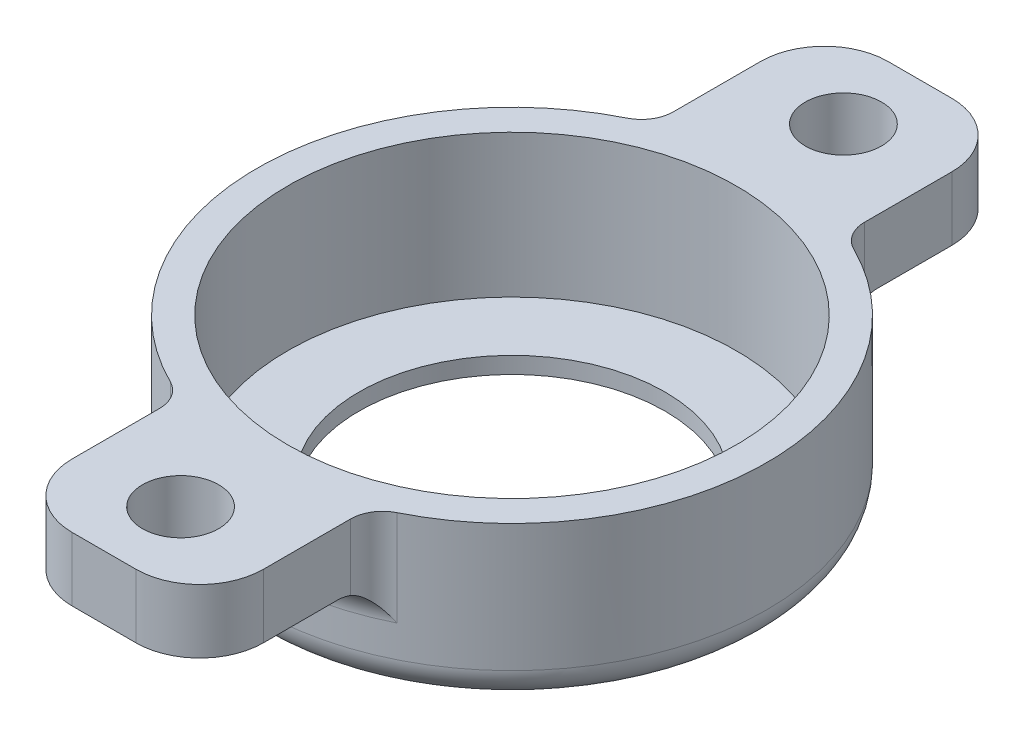
ISO-10303-21;
HEADER;
FILE_DESCRIPTION(('STEP AP214'),'2;1');
FILE_NAME('part.step','',(''),(''),'','','');
FILE_SCHEMA(('AUTOMOTIVE_DESIGN { 1 0 10303 214 1 1 1 1 }'));
ENDSEC;
DATA;
#1=APPLICATION_CONTEXT('core data for automotive mechanical design processes');
#2=APPLICATION_PROTOCOL_DEFINITION('international standard','automotive_design',2000,#1);
#3=PRODUCT_CONTEXT('',#1,'mechanical');
#4=PRODUCT('Part','Part','',(#3));
#5=PRODUCT_RELATED_PRODUCT_CATEGORY('part','',(#4));
#6=PRODUCT_DEFINITION_FORMATION('','',#4);
#7=PRODUCT_DEFINITION_CONTEXT('part definition',#1,'design');
#8=PRODUCT_DEFINITION('design','',#6,#7);
#9=PRODUCT_DEFINITION_SHAPE('','',#8);
#10=(LENGTH_UNIT() NAMED_UNIT(*) SI_UNIT(.MILLI.,.METRE.));
#11=(NAMED_UNIT(*) PLANE_ANGLE_UNIT() SI_UNIT($,.RADIAN.));
#12=(NAMED_UNIT(*) SI_UNIT($,.STERADIAN.) SOLID_ANGLE_UNIT());
#13=UNCERTAINTY_MEASURE_WITH_UNIT(LENGTH_MEASURE(1.E-05),#10,'distance_accuracy_value','');
#14=(GEOMETRIC_REPRESENTATION_CONTEXT(3) GLOBAL_UNCERTAINTY_ASSIGNED_CONTEXT((#13)) GLOBAL_UNIT_ASSIGNED_CONTEXT((#10,
#11,#12)) REPRESENTATION_CONTEXT('',''));
#15=CARTESIAN_POINT('',(0.,0.,0.));
#16=DIRECTION('',(0.,0.,1.));
#17=DIRECTION('',(1.,0.,0.));
#18=AXIS2_PLACEMENT_3D('',#15,#16,#17);
#19=CARTESIAN_POINT('',(0.,0.,0.));
#20=DIRECTION('',(0.,1.,0.));
#21=DIRECTION('',(0.,0.,1.));
#22=AXIS2_PLACEMENT_3D('',#19,#20,#21);
#23=CYLINDRICAL_SURFACE('',#22,7.62);
#24=CARTESIAN_POINT('',(0.,0.,0.));
#25=DIRECTION('',(0.,1.,0.));
#26=DIRECTION('',(0.,0.,1.));
#27=AXIS2_PLACEMENT_3D('',#24,#25,#26);
#28=CIRCLE('',#27,7.62);
#29=CARTESIAN_POINT('',(0.,0.,7.62));
#30=VERTEX_POINT('',#29);
#31=EDGE_CURVE('E395',#30,#30,#28,.T.);
#32=ORIENTED_EDGE('',*,*,#31,.F.);
#33=EDGE_LOOP('',(#32));
#34=FACE_BOUND('',#33,.T.);
#35=CARTESIAN_POINT('',(0.,0.8255,0.));
#36=DIRECTION('',(0.,1.,0.));
#37=DIRECTION('',(0.,0.,1.));
#38=AXIS2_PLACEMENT_3D('',#35,#36,#37);
#39=CIRCLE('',#38,7.62);
#40=CARTESIAN_POINT('',(0.,0.8255,7.62));
#41=VERTEX_POINT('',#40);
#42=EDGE_CURVE('E390',#41,#41,#39,.F.);
#43=ORIENTED_EDGE('',*,*,#42,.F.);
#44=EDGE_LOOP('',(#43));
#45=FACE_BOUND('',#44,.T.);
#46=ADVANCED_FACE('F36',(#34,#45),#23,.F.);
#47=CARTESIAN_POINT('',(0.,7.9375,0.));
#48=DIRECTION('',(0.,-1.,0.));
#49=DIRECTION('',(0.,0.,-1.));
#50=AXIS2_PLACEMENT_3D('',#47,#48,#49);
#51=CYLINDRICAL_SURFACE('',#50,12.7);
#52=CARTESIAN_POINT('',(0.,1.5875,0.));
#53=DIRECTION('',(0.,1.,0.));
#54=DIRECTION('',(0.,0.,1.));
#55=AXIS2_PLACEMENT_3D('',#52,#53,#54);
#56=CIRCLE('',#55,12.7);
#57=CARTESIAN_POINT('',(0.,1.5875,12.7));
#58=VERTEX_POINT('',#57);
#59=EDGE_CURVE('E237',#58,#58,#56,.T.);
#60=ORIENTED_EDGE('',*,*,#59,.T.);
#61=EDGE_LOOP('',(#60));
#62=FACE_BOUND('',#61,.T.);
#63=CARTESIAN_POINT('',(0.,3.175,0.));
#64=DIRECTION('',(0.,1.,0.));
#65=DIRECTION('',(0.,0.,1.));
#66=AXIS2_PLACEMENT_3D('',#63,#64,#65);
#67=CIRCLE('',#66,12.7);
#68=CARTESIAN_POINT('',(5.64444444444444,3.175,11.3767414892657));
#69=VERTEX_POINT('',#68);
#70=CARTESIAN_POINT('',(-5.64444444444444,3.175,11.3767414892657));
#71=VERTEX_POINT('',#70);
#72=EDGE_CURVE('E247',#69,#71,#67,.F.);
#73=ORIENTED_EDGE('',*,*,#72,.T.);
#74=DIRECTION('',(0.,-1.,0.));
#75=VECTOR('',#74,1.);
#76=CARTESIAN_POINT('',(-5.64444444444444,7.9375,11.3767414892657));
#77=LINE('',#76,#75);
#78=CARTESIAN_POINT('',(-5.64444444444444,7.9375,11.3767414892657));
#79=VERTEX_POINT('',#78);
#80=EDGE_CURVE('E251',#71,#79,#77,.F.);
#81=ORIENTED_EDGE('',*,*,#80,.T.);
#82=CARTESIAN_POINT('',(0.,7.9375,0.));
#83=DIRECTION('',(0.,1.,0.));
#84=DIRECTION('',(0.,0.,1.));
#85=AXIS2_PLACEMENT_3D('',#82,#83,#84);
#86=CIRCLE('',#85,12.7);
#87=CARTESIAN_POINT('',(-5.64444444444444,7.9375,-11.3767414892657));
#88=VERTEX_POINT('',#87);
#89=EDGE_CURVE('E195',#88,#79,#86,.T.);
#90=ORIENTED_EDGE('',*,*,#89,.F.);
#91=DIRECTION('',(0.,-1.,0.));
#92=VECTOR('',#91,1.);
#93=CARTESIAN_POINT('',(-5.64444444444445,7.9375,-11.3767414892657));
#94=LINE('',#93,#92);
#95=CARTESIAN_POINT('',(-5.64444444444444,3.175,-11.3767414892657));
#96=VERTEX_POINT('',#95);
#97=EDGE_CURVE('E242',#88,#96,#94,.T.);
#98=ORIENTED_EDGE('',*,*,#97,.T.);
#99=CARTESIAN_POINT('',(0.,3.175,0.));
#100=DIRECTION('',(0.,1.,0.));
#101=DIRECTION('',(0.,0.,1.));
#102=AXIS2_PLACEMENT_3D('',#99,#100,#101);
#103=CIRCLE('',#102,12.7);
#104=CARTESIAN_POINT('',(5.64444444444444,3.175,-11.3767414892657));
#105=VERTEX_POINT('',#104);
#106=EDGE_CURVE('E240',#96,#105,#103,.F.);
#107=ORIENTED_EDGE('',*,*,#106,.T.);
#108=DIRECTION('',(0.,-1.,0.));
#109=VECTOR('',#108,1.);
#110=CARTESIAN_POINT('',(5.64444444444444,7.9375,-11.3767414892657));
#111=LINE('',#110,#109);
#112=CARTESIAN_POINT('',(5.64444444444444,7.9375,-11.3767414892657));
#113=VERTEX_POINT('',#112);
#114=EDGE_CURVE('E244',#105,#113,#111,.F.);
#115=ORIENTED_EDGE('',*,*,#114,.T.);
#116=CARTESIAN_POINT('',(5.64444444444444,7.9375,11.3767414892657));
#117=VERTEX_POINT('',#116);
#118=EDGE_CURVE('E199',#117,#113,#86,.T.);
#119=ORIENTED_EDGE('',*,*,#118,.F.);
#120=DIRECTION('',(0.,-1.,0.));
#121=VECTOR('',#120,1.);
#122=CARTESIAN_POINT('',(5.64444444444445,7.9375,11.3767414892657));
#123=LINE('',#122,#121);
#124=EDGE_CURVE('E249',#117,#69,#123,.T.);
#125=ORIENTED_EDGE('',*,*,#124,.T.);
#126=EDGE_LOOP('',(#73,#81,#90,#98,#107,#115,#119,#125));
#127=FACE_BOUND('',#126,.T.);
#128=ADVANCED_FACE('F376',(#62,#127),#51,.T.);
#129=CARTESIAN_POINT('',(0.,7.9375,0.));
#130=DIRECTION('',(0.,1.,0.));
#131=DIRECTION('',(0.,0.,1.));
#132=AXIS2_PLACEMENT_3D('',#129,#130,#131);
#133=PLANE('',#132);
#134=CARTESIAN_POINT('',(0.,7.9375,16.51));
#135=DIRECTION('',(0.,1.,0.));
#136=DIRECTION('',(0.,0.,1.));
#137=AXIS2_PLACEMENT_3D('',#134,#135,#136);
#138=CIRCLE('',#137,1.9);
#139=CARTESIAN_POINT('',(0.,7.9375,18.41));
#140=VERTEX_POINT('',#139);
#141=EDGE_CURVE('E217',#140,#140,#138,.T.);
#142=ORIENTED_EDGE('',*,*,#141,.F.);
#143=EDGE_LOOP('',(#142));
#144=FACE_BOUND('',#143,.T.);
#145=CARTESIAN_POINT('',(0.,7.9375,-16.51));
#146=DIRECTION('',(0.,1.,0.));
#147=DIRECTION('',(0.,0.,1.));
#148=AXIS2_PLACEMENT_3D('',#145,#146,#147);
#149=CIRCLE('',#148,1.9);
#150=CARTESIAN_POINT('',(0.,7.9375,-14.61));
#151=VERTEX_POINT('',#150);
#152=EDGE_CURVE('E467',#151,#151,#149,.T.);
#153=ORIENTED_EDGE('',*,*,#152,.F.);
#154=EDGE_LOOP('',(#153));
#155=FACE_BOUND('',#154,.T.);
#156=CARTESIAN_POINT('',(0.,7.9375,0.));
#157=DIRECTION('',(0.,1.,0.));
#158=DIRECTION('',(0.,0.,1.));
#159=AXIS2_PLACEMENT_3D('',#156,#157,#158);
#160=CIRCLE('',#159,11.176);
#161=CARTESIAN_POINT('',(0.,7.9375,11.176));
#162=VERTEX_POINT('',#161);
#163=EDGE_CURVE('E391',#162,#162,#160,.T.);
#164=ORIENTED_EDGE('',*,*,#163,.F.);
#165=EDGE_LOOP('',(#164));
#166=FACE_BOUND('',#165,.T.);
#167=DIRECTION('',(1.,0.,0.));
#168=VECTOR('',#167,1.);
#169=CARTESIAN_POINT('',(4.7625,7.9375,20.32));
#170=LINE('',#169,#168);
#171=CARTESIAN_POINT('',(-1.5875,7.9375,20.32));
#172=VERTEX_POINT('',#171);
#173=CARTESIAN_POINT('',(1.5875,7.9375,20.32));
#174=VERTEX_POINT('',#173);
#175=EDGE_CURVE('E463',#172,#174,#170,.T.);
#176=ORIENTED_EDGE('',*,*,#175,.T.);
#177=CARTESIAN_POINT('',(1.5875,7.9375,17.145));
#178=DIRECTION('',(0.,1.,0.));
#179=DIRECTION('',(0.,0.,1.));
#180=AXIS2_PLACEMENT_3D('',#177,#178,#179);
#181=CIRCLE('',#180,3.175);
#182=CARTESIAN_POINT('',(4.7625,7.9375,17.145));
#183=VERTEX_POINT('',#182);
#184=EDGE_CURVE('E225',#174,#183,#181,.T.);
#185=ORIENTED_EDGE('',*,*,#184,.T.);
#186=DIRECTION('',(0.,0.,-1.));
#187=VECTOR('',#186,1.);
#188=CARTESIAN_POINT('',(4.7625,7.9375,11.7732150982644));
#189=LINE('',#188,#187);
#190=CARTESIAN_POINT('',(4.7625,7.9375,12.7988341754239));
#191=VERTEX_POINT('',#190);
#192=EDGE_CURVE('E457',#183,#191,#189,.T.);
#193=ORIENTED_EDGE('',*,*,#192,.T.);
#194=CARTESIAN_POINT('',(6.35,7.9375,12.7988341754239));
#195=DIRECTION('',(0.,1.,0.));
#196=DIRECTION('',(0.,0.,1.));
#197=AXIS2_PLACEMENT_3D('',#194,#195,#196);
#198=CIRCLE('',#197,1.5875);
#199=EDGE_CURVE('E269',#191,#117,#198,.F.);
#200=ORIENTED_EDGE('',*,*,#199,.T.);
#201=ORIENTED_EDGE('',*,*,#118,.T.);
#202=CARTESIAN_POINT('',(6.35,7.9375,-12.7988341754239));
#203=DIRECTION('',(0.,1.,0.));
#204=DIRECTION('',(0.,0.,1.));
#205=AXIS2_PLACEMENT_3D('',#202,#203,#204);
#206=CIRCLE('',#205,1.5875);
#207=CARTESIAN_POINT('',(4.7625,7.9375,-12.7988341754239));
#208=VERTEX_POINT('',#207);
#209=EDGE_CURVE('E271',#113,#208,#206,.F.);
#210=ORIENTED_EDGE('',*,*,#209,.T.);
#211=DIRECTION('',(0.,0.,-1.));
#212=VECTOR('',#211,1.);
#213=CARTESIAN_POINT('',(4.7625,7.9375,-20.32));
#214=LINE('',#213,#212);
#215=CARTESIAN_POINT('',(4.7625,7.9375,-17.145));
#216=VERTEX_POINT('',#215);
#217=EDGE_CURVE('E174',#208,#216,#214,.T.);
#218=ORIENTED_EDGE('',*,*,#217,.T.);
#219=CARTESIAN_POINT('',(1.5875,7.9375,-17.145));
#220=DIRECTION('',(0.,1.,0.));
#221=DIRECTION('',(0.,0.,1.));
#222=AXIS2_PLACEMENT_3D('',#219,#220,#221);
#223=CIRCLE('',#222,3.175);
#224=CARTESIAN_POINT('',(1.5875,7.9375,-20.32));
#225=VERTEX_POINT('',#224);
#226=EDGE_CURVE('E169',#216,#225,#223,.T.);
#227=ORIENTED_EDGE('',*,*,#226,.T.);
#228=DIRECTION('',(-1.,0.,0.));
#229=VECTOR('',#228,1.);
#230=CARTESIAN_POINT('',(-4.7625,7.9375,-20.32));
#231=LINE('',#230,#229);
#232=CARTESIAN_POINT('',(-1.5875,7.9375,-20.32));
#233=VERTEX_POINT('',#232);
#234=EDGE_CURVE('E173',#225,#233,#231,.T.);
#235=ORIENTED_EDGE('',*,*,#234,.T.);
#236=CARTESIAN_POINT('',(-1.5875,7.9375,-17.145));
#237=DIRECTION('',(0.,1.,0.));
#238=DIRECTION('',(0.,0.,1.));
#239=AXIS2_PLACEMENT_3D('',#236,#237,#238);
#240=CIRCLE('',#239,3.175);
#241=CARTESIAN_POINT('',(-4.7625,7.9375,-17.145));
#242=VERTEX_POINT('',#241);
#243=EDGE_CURVE('E179',#233,#242,#240,.T.);
#244=ORIENTED_EDGE('',*,*,#243,.T.);
#245=DIRECTION('',(0.,0.,1.));
#246=VECTOR('',#245,1.);
#247=CARTESIAN_POINT('',(-4.7625,7.9375,-11.7732150982644));
#248=LINE('',#247,#246);
#249=CARTESIAN_POINT('',(-4.7625,7.9375,-12.7988341754239));
#250=VERTEX_POINT('',#249);
#251=EDGE_CURVE('E189',#242,#250,#248,.T.);
#252=ORIENTED_EDGE('',*,*,#251,.T.);
#253=CARTESIAN_POINT('',(-6.35,7.9375,-12.7988341754239));
#254=DIRECTION('',(0.,1.,0.));
#255=DIRECTION('',(0.,0.,1.));
#256=AXIS2_PLACEMENT_3D('',#253,#254,#255);
#257=CIRCLE('',#256,1.5875);
#258=EDGE_CURVE('E273',#250,#88,#257,.F.);
#259=ORIENTED_EDGE('',*,*,#258,.T.);
#260=ORIENTED_EDGE('',*,*,#89,.T.);
#261=CARTESIAN_POINT('',(-6.35,7.9375,12.7988341754239));
#262=DIRECTION('',(0.,1.,0.));
#263=DIRECTION('',(0.,0.,1.));
#264=AXIS2_PLACEMENT_3D('',#261,#262,#263);
#265=CIRCLE('',#264,1.5875);
#266=CARTESIAN_POINT('',(-4.7625,7.9375,12.7988341754239));
#267=VERTEX_POINT('',#266);
#268=EDGE_CURVE('E267',#79,#267,#265,.F.);
#269=ORIENTED_EDGE('',*,*,#268,.T.);
#270=DIRECTION('',(0.,0.,1.));
#271=VECTOR('',#270,1.);
#272=CARTESIAN_POINT('',(-4.7625,7.9375,20.32));
#273=LINE('',#272,#271);
#274=CARTESIAN_POINT('',(-4.7625,7.9375,17.145));
#275=VERTEX_POINT('',#274);
#276=EDGE_CURVE('E461',#267,#275,#273,.T.);
#277=ORIENTED_EDGE('',*,*,#276,.T.);
#278=CARTESIAN_POINT('',(-1.5875,7.9375,17.145));
#279=DIRECTION('',(0.,1.,0.));
#280=DIRECTION('',(0.,0.,1.));
#281=AXIS2_PLACEMENT_3D('',#278,#279,#280);
#282=CIRCLE('',#281,3.175);
#283=EDGE_CURVE('E223',#275,#172,#282,.T.);
#284=ORIENTED_EDGE('',*,*,#283,.T.);
#285=EDGE_LOOP('',(#176,#185,#193,#200,#201,#210,#218,#227,#235,#244,#252,#259,#260,#269,#277,#284));
#286=FACE_BOUND('',#285,.T.);
#287=ADVANCED_FACE('F172',(#144,#155,#166,#286),#133,.T.);
#288=CARTESIAN_POINT('',(0.,0.,0.));
#289=DIRECTION('',(0.,1.,0.));
#290=DIRECTION('',(0.,0.,1.));
#291=AXIS2_PLACEMENT_3D('',#288,#289,#290);
#292=PLANE('',#291);
#293=CARTESIAN_POINT('',(0.,0.,0.));
#294=DIRECTION('',(0.,1.,0.));
#295=DIRECTION('',(0.,0.,1.));
#296=AXIS2_PLACEMENT_3D('',#293,#294,#295);
#297=CIRCLE('',#296,11.1125);
#298=CARTESIAN_POINT('',(0.,0.,11.1125));
#299=VERTEX_POINT('',#298);
#300=EDGE_CURVE('E264',#299,#299,#297,.F.);
#301=ORIENTED_EDGE('',*,*,#300,.T.);
#302=EDGE_LOOP('',(#301));
#303=FACE_BOUND('',#302,.T.);
#304=ORIENTED_EDGE('',*,*,#31,.T.);
#305=EDGE_LOOP('',(#304));
#306=FACE_BOUND('',#305,.T.);
#307=ADVANCED_FACE('F416',(#303,#306),#292,.F.);
#308=CARTESIAN_POINT('',(0.,0.8255,0.));
#309=DIRECTION('',(0.,1.,0.));
#310=DIRECTION('',(0.,0.,1.));
#311=AXIS2_PLACEMENT_3D('',#308,#309,#310);
#312=PLANE('',#311);
#313=CARTESIAN_POINT('',(0.,0.8255,0.));
#314=DIRECTION('',(0.,1.,0.));
#315=DIRECTION('',(0.,0.,1.));
#316=AXIS2_PLACEMENT_3D('',#313,#314,#315);
#317=CIRCLE('',#316,11.176);
#318=CARTESIAN_POINT('',(0.,0.8255,11.176));
#319=VERTEX_POINT('',#318);
#320=EDGE_CURVE('E387',#319,#319,#317,.T.);
#321=ORIENTED_EDGE('',*,*,#320,.T.);
#322=EDGE_LOOP('',(#321));
#323=FACE_BOUND('',#322,.T.);
#324=ORIENTED_EDGE('',*,*,#42,.T.);
#325=EDGE_LOOP('',(#324));
#326=FACE_BOUND('',#325,.T.);
#327=ADVANCED_FACE('F400',(#323,#326),#312,.T.);
#328=CARTESIAN_POINT('',(0.,0.8255,0.));
#329=DIRECTION('',(0.,1.,0.));
#330=DIRECTION('',(0.,0.,1.));
#331=AXIS2_PLACEMENT_3D('',#328,#329,#330);
#332=CYLINDRICAL_SURFACE('',#331,11.176);
#333=ORIENTED_EDGE('',*,*,#320,.F.);
#334=EDGE_LOOP('',(#333));
#335=FACE_BOUND('',#334,.T.);
#336=ORIENTED_EDGE('',*,*,#163,.T.);
#337=EDGE_LOOP('',(#336));
#338=FACE_BOUND('',#337,.T.);
#339=ADVANCED_FACE('F316',(#335,#338),#332,.F.);
#340=CARTESIAN_POINT('',(-4.7625,4.7625,-11.7732150982644));
#341=DIRECTION('',(-1.,0.,0.));
#342=DIRECTION('',(0.,0.,1.));
#343=AXIS2_PLACEMENT_3D('',#340,#341,#342);
#344=PLANE('',#343);
#345=DIRECTION('',(0.,0.,1.));
#346=VECTOR('',#345,1.);
#347=CARTESIAN_POINT('',(-4.7625,4.7625,-11.7732150982644));
#348=LINE('',#347,#346);
#349=CARTESIAN_POINT('',(-4.7625,4.7625,-17.145));
#350=VERTEX_POINT('',#349);
#351=CARTESIAN_POINT('',(-4.7625,4.7625,-13.4703841816037));
#352=VERTEX_POINT('',#351);
#353=EDGE_CURVE('E394',#350,#352,#348,.T.);
#354=ORIENTED_EDGE('',*,*,#353,.T.);
#355=CARTESIAN_POINT('',(-4.76250000000006,4.7625,-13.4703841816037));
#356=CARTESIAN_POINT('',(-4.76250000000002,4.76250517361705,-13.412746171784));
#357=CARTESIAN_POINT('',(-4.76250000000001,4.75970974387124,-13.355110362208));
#358=CARTESIAN_POINT('',(-4.7625,4.74863278776513,-13.2409031936618));
#359=CARTESIAN_POINT('',(-4.7625,4.74040191248098,-13.1843269200883));
#360=CARTESIAN_POINT('',(-4.7625,4.71856691558919,-13.0722224279501));
#361=CARTESIAN_POINT('',(-4.7625,4.70496301463108,-13.0166941664457));
#362=CARTESIAN_POINT('',(-4.7625,4.67233879176669,-12.9066919498976));
#363=CARTESIAN_POINT('',(-4.7625,4.65326940580145,-12.8522325492046));
#364=CARTESIAN_POINT('',(-4.7625,4.63157325695178,-12.7988341754239));
#365=B_SPLINE_CURVE_WITH_KNOTS('',3,(#355,#356,#357,#358,#359,#360,#361,#362,#363,#364),
.UNSPECIFIED.,.F.,.F.,(4,2,2,2,4),(0.,0.172843013196444,0.344097669108095,0.515345292980043,
0.688181140364362),.UNSPECIFIED.);
#366=CARTESIAN_POINT('',(-4.7625,4.63157325695178,-12.7988341754239));
#367=VERTEX_POINT('',#366);
#368=EDGE_CURVE('E11',#352,#367,#365,.T.);
#369=ORIENTED_EDGE('',*,*,#368,.T.);
#370=DIRECTION('',(0.,-1.,0.));
#371=VECTOR('',#370,1.);
#372=CARTESIAN_POINT('',(-4.7625,4.7625,-12.7988341754239));
#373=LINE('',#372,#371);
#374=EDGE_CURVE('E58',#367,#250,#373,.F.);
#375=ORIENTED_EDGE('',*,*,#374,.T.);
#376=ORIENTED_EDGE('',*,*,#251,.F.);
#377=DIRECTION('',(0.,1.,0.));
#378=VECTOR('',#377,1.);
#379=CARTESIAN_POINT('',(-4.7625,4.7625,-17.145));
#380=LINE('',#379,#378);
#381=EDGE_CURVE('E206',#242,#350,#380,.F.);
#382=ORIENTED_EDGE('',*,*,#381,.T.);
#383=EDGE_LOOP('',(#354,#369,#375,#376,#382));
#384=FACE_BOUND('',#383,.T.);
#385=ADVANCED_FACE('F312',(#384),#344,.T.);
#386=CARTESIAN_POINT('',(-4.7625,4.7625,-20.32));
#387=DIRECTION('',(0.,0.,-1.));
#388=DIRECTION('',(-1.,0.,0.));
#389=AXIS2_PLACEMENT_3D('',#386,#387,#388);
#390=PLANE('',#389);
#391=DIRECTION('',(-1.,0.,0.));
#392=VECTOR('',#391,1.);
#393=CARTESIAN_POINT('',(-4.7625,4.7625,-20.32));
#394=LINE('',#393,#392);
#395=CARTESIAN_POINT('',(1.5875,4.7625,-20.32));
#396=VERTEX_POINT('',#395);
#397=CARTESIAN_POINT('',(-1.5875,4.7625,-20.32));
#398=VERTEX_POINT('',#397);
#399=EDGE_CURVE('E383',#396,#398,#394,.T.);
#400=ORIENTED_EDGE('',*,*,#399,.T.);
#401=DIRECTION('',(0.,1.,0.));
#402=VECTOR('',#401,1.);
#403=CARTESIAN_POINT('',(-1.5875,4.7625,-20.32));
#404=LINE('',#403,#402);
#405=EDGE_CURVE('E180',#398,#233,#404,.T.);
#406=ORIENTED_EDGE('',*,*,#405,.T.);
#407=ORIENTED_EDGE('',*,*,#234,.F.);
#408=DIRECTION('',(0.,1.,0.));
#409=VECTOR('',#408,1.);
#410=CARTESIAN_POINT('',(1.5875,4.7625,-20.32));
#411=LINE('',#410,#409);
#412=EDGE_CURVE('E186',#225,#396,#411,.F.);
#413=ORIENTED_EDGE('',*,*,#412,.T.);
#414=EDGE_LOOP('',(#400,#406,#407,#413));
#415=FACE_BOUND('',#414,.T.);
#416=ADVANCED_FACE('F185',(#415),#390,.T.);
#417=CARTESIAN_POINT('',(4.7625,4.7625,-20.32));
#418=DIRECTION('',(1.,0.,0.));
#419=DIRECTION('',(0.,0.,-1.));
#420=AXIS2_PLACEMENT_3D('',#417,#418,#419);
#421=PLANE('',#420);
#422=ORIENTED_EDGE('',*,*,#217,.F.);
#423=DIRECTION('',(0.,-1.,0.));
#424=VECTOR('',#423,1.);
#425=CARTESIAN_POINT('',(4.7625,4.7625,-12.7988341754239));
#426=LINE('',#425,#424);
#427=CARTESIAN_POINT('',(4.7625,4.63157325695178,-12.7988341754239));
#428=VERTEX_POINT('',#427);
#429=EDGE_CURVE('E65',#208,#428,#426,.T.);
#430=ORIENTED_EDGE('',*,*,#429,.T.);
#431=CARTESIAN_POINT('',(4.7625,4.63157325695178,-12.7988341754239));
#432=CARTESIAN_POINT('',(4.7625,4.65326940580145,-12.8522325492046));
#433=CARTESIAN_POINT('',(4.7625,4.67233879176669,-12.9066919498977));
#434=CARTESIAN_POINT('',(4.7625,4.70496301463108,-13.0166941664457));
#435=CARTESIAN_POINT('',(4.7625,4.71856691558919,-13.0722224279501));
#436=CARTESIAN_POINT('',(4.7625,4.74040191248098,-13.1843269200883));
#437=CARTESIAN_POINT('',(4.7625,4.74863278776513,-13.2409031936618));
#438=CARTESIAN_POINT('',(4.7625,4.75970974387124,-13.355110362208));
#439=CARTESIAN_POINT('',(4.7625,4.76250517361705,-13.412746171784));
#440=CARTESIAN_POINT('',(4.7625,4.7625,-13.4703841816037));
#441=B_SPLINE_CURVE_WITH_KNOTS('',3,(#431,#432,#433,#434,#435,#436,#437,#438,#439,#440),
.UNSPECIFIED.,.F.,.F.,(4,2,2,2,4),(0.,0.172835847384323,0.344083471256273,0.515338127167929,
0.688181140364379),.UNSPECIFIED.);
#442=CARTESIAN_POINT('',(4.7625,4.7625,-13.4703841816037));
#443=VERTEX_POINT('',#442);
#444=EDGE_CURVE('E50',#428,#443,#441,.T.);
#445=ORIENTED_EDGE('',*,*,#444,.T.);
#446=DIRECTION('',(0.,0.,-1.));
#447=VECTOR('',#446,1.);
#448=CARTESIAN_POINT('',(4.7625,4.7625,-20.32));
#449=LINE('',#448,#447);
#450=CARTESIAN_POINT('',(4.7625,4.7625,-17.145));
#451=VERTEX_POINT('',#450);
#452=EDGE_CURVE('E381',#443,#451,#449,.T.);
#453=ORIENTED_EDGE('',*,*,#452,.T.);
#454=DIRECTION('',(0.,1.,0.));
#455=VECTOR('',#454,1.);
#456=CARTESIAN_POINT('',(4.7625,4.7625,-17.145));
#457=LINE('',#456,#455);
#458=EDGE_CURVE('E211',#451,#216,#457,.T.);
#459=ORIENTED_EDGE('',*,*,#458,.T.);
#460=EDGE_LOOP('',(#422,#430,#445,#453,#459));
#461=FACE_BOUND('',#460,.T.);
#462=ADVANCED_FACE('F310',(#461),#421,.T.);
#463=CARTESIAN_POINT('',(0.,4.7625,0.));
#464=DIRECTION('',(0.,1.,0.));
#465=DIRECTION('',(0.,0.,1.));
#466=AXIS2_PLACEMENT_3D('',#463,#464,#465);
#467=PLANE('',#466);
#468=CARTESIAN_POINT('',(0.,4.7625,-16.51));
#469=DIRECTION('',(0.,1.,0.));
#470=DIRECTION('',(0.,0.,1.));
#471=AXIS2_PLACEMENT_3D('',#468,#469,#470);
#472=CIRCLE('',#471,1.9);
#473=CARTESIAN_POINT('',(0.,4.7625,-14.61));
#474=VERTEX_POINT('',#473);
#475=EDGE_CURVE('E202',#474,#474,#472,.T.);
#476=ORIENTED_EDGE('',*,*,#475,.T.);
#477=EDGE_LOOP('',(#476));
#478=FACE_BOUND('',#477,.T.);
#479=ORIENTED_EDGE('',*,*,#452,.F.);
#480=CARTESIAN_POINT('',(0.,4.7625,0.));
#481=DIRECTION('',(0.,1.,0.));
#482=DIRECTION('',(0.,0.,1.));
#483=AXIS2_PLACEMENT_3D('',#480,#481,#482);
#484=CIRCLE('',#483,14.2875);
#485=EDGE_CURVE('E262',#443,#352,#484,.T.);
#486=ORIENTED_EDGE('',*,*,#485,.T.);
#487=ORIENTED_EDGE('',*,*,#353,.F.);
#488=CARTESIAN_POINT('',(-1.5875,4.7625,-17.145));
#489=DIRECTION('',(0.,1.,0.));
#490=DIRECTION('',(0.,0.,1.));
#491=AXIS2_PLACEMENT_3D('',#488,#489,#490);
#492=CIRCLE('',#491,3.175);
#493=EDGE_CURVE('E209',#350,#398,#492,.F.);
#494=ORIENTED_EDGE('',*,*,#493,.T.);
#495=ORIENTED_EDGE('',*,*,#399,.F.);
#496=CARTESIAN_POINT('',(1.5875,4.7625,-17.145));
#497=DIRECTION('',(0.,1.,0.));
#498=DIRECTION('',(0.,0.,1.));
#499=AXIS2_PLACEMENT_3D('',#496,#497,#498);
#500=CIRCLE('',#499,3.175);
#501=EDGE_CURVE('E194',#396,#451,#500,.F.);
#502=ORIENTED_EDGE('',*,*,#501,.T.);
#503=EDGE_LOOP('',(#479,#486,#487,#494,#495,#502));
#504=FACE_BOUND('',#503,.T.);
#505=ADVANCED_FACE('F306',(#478,#504),#467,.F.);
#506=CARTESIAN_POINT('',(0.,0.,-16.51));
#507=DIRECTION('',(0.,1.,0.));
#508=DIRECTION('',(0.,0.,1.));
#509=AXIS2_PLACEMENT_3D('',#506,#507,#508);
#510=CYLINDRICAL_SURFACE('',#509,1.9);
#511=ORIENTED_EDGE('',*,*,#152,.T.);
#512=EDGE_LOOP('',(#511));
#513=FACE_BOUND('',#512,.T.);
#514=ORIENTED_EDGE('',*,*,#475,.F.);
#515=EDGE_LOOP('',(#514));
#516=FACE_BOUND('',#515,.T.);
#517=ADVANCED_FACE('F302',(#513,#516),#510,.F.);
#518=CARTESIAN_POINT('',(-1.5875,4.7625,-17.145));
#519=DIRECTION('',(0.,1.,0.));
#520=DIRECTION('',(0.,0.,1.));
#521=AXIS2_PLACEMENT_3D('',#518,#519,#520);
#522=CYLINDRICAL_SURFACE('',#521,3.175);
#523=ORIENTED_EDGE('',*,*,#493,.F.);
#524=ORIENTED_EDGE('',*,*,#381,.F.);
#525=ORIENTED_EDGE('',*,*,#243,.F.);
#526=ORIENTED_EDGE('',*,*,#405,.F.);
#527=EDGE_LOOP('',(#523,#524,#525,#526));
#528=FACE_BOUND('',#527,.T.);
#529=ADVANCED_FACE('F305',(#528),#522,.T.);
#530=CARTESIAN_POINT('',(1.5875,4.7625,-17.145));
#531=DIRECTION('',(0.,1.,0.));
#532=DIRECTION('',(0.,0.,1.));
#533=AXIS2_PLACEMENT_3D('',#530,#531,#532);
#534=CYLINDRICAL_SURFACE('',#533,3.175);
#535=ORIENTED_EDGE('',*,*,#501,.F.);
#536=ORIENTED_EDGE('',*,*,#412,.F.);
#537=ORIENTED_EDGE('',*,*,#226,.F.);
#538=ORIENTED_EDGE('',*,*,#458,.F.);
#539=EDGE_LOOP('',(#535,#536,#537,#538));
#540=FACE_BOUND('',#539,.T.);
#541=ADVANCED_FACE('F192',(#540),#534,.T.);
#542=CARTESIAN_POINT('',(4.7625,4.7625,11.7732150982644));
#543=DIRECTION('',(1.,0.,0.));
#544=DIRECTION('',(0.,0.,-1.));
#545=AXIS2_PLACEMENT_3D('',#542,#543,#544);
#546=PLANE('',#545);
#547=DIRECTION('',(0.,0.,-1.));
#548=VECTOR('',#547,1.);
#549=CARTESIAN_POINT('',(4.7625,4.7625,11.7732150982644));
#550=LINE('',#549,#548);
#551=CARTESIAN_POINT('',(4.7625,4.7625,17.145));
#552=VERTEX_POINT('',#551);
#553=CARTESIAN_POINT('',(4.7625,4.7625,13.4703841816037));
#554=VERTEX_POINT('',#553);
#555=EDGE_CURVE('E453',#552,#554,#550,.T.);
#556=ORIENTED_EDGE('',*,*,#555,.T.);
#557=CARTESIAN_POINT('',(4.76250000000006,4.7625,13.4703841816037));
#558=CARTESIAN_POINT('',(4.76250000000002,4.76250517361705,13.412746171784));
#559=CARTESIAN_POINT('',(4.76250000000001,4.75970974387124,13.355110362208));
#560=CARTESIAN_POINT('',(4.7625,4.74863278776513,13.2409031936618));
#561=CARTESIAN_POINT('',(4.7625,4.74040191248098,13.1843269200883));
#562=CARTESIAN_POINT('',(4.7625,4.71856691558919,13.0722224279501));
#563=CARTESIAN_POINT('',(4.7625,4.70496301463108,13.0166941664457));
#564=CARTESIAN_POINT('',(4.7625,4.67233879176669,12.9066919498976));
#565=CARTESIAN_POINT('',(4.7625,4.65326940580145,12.8522325492046));
#566=CARTESIAN_POINT('',(4.7625,4.63157325695178,12.7988341754239));
#567=B_SPLINE_CURVE_WITH_KNOTS('',3,(#557,#558,#559,#560,#561,#562,#563,#564,#565,#566),
.UNSPECIFIED.,.F.,.F.,(4,2,2,2,4),(0.,0.172843013196444,0.344097669108095,0.515345292980043,
0.688181140364362),.UNSPECIFIED.);
#568=CARTESIAN_POINT('',(4.7625,4.63157325695178,12.7988341754239));
#569=VERTEX_POINT('',#568);
#570=EDGE_CURVE('E283',#554,#569,#567,.T.);
#571=ORIENTED_EDGE('',*,*,#570,.T.);
#572=DIRECTION('',(0.,-1.,0.));
#573=VECTOR('',#572,1.);
#574=CARTESIAN_POINT('',(4.7625,4.7625,12.7988341754239));
#575=LINE('',#574,#573);
#576=EDGE_CURVE('E256',#569,#191,#575,.F.);
#577=ORIENTED_EDGE('',*,*,#576,.T.);
#578=ORIENTED_EDGE('',*,*,#192,.F.);
#579=DIRECTION('',(0.,1.,0.));
#580=VECTOR('',#579,1.);
#581=CARTESIAN_POINT('',(4.7625,4.7625,17.145));
#582=LINE('',#581,#580);
#583=EDGE_CURVE('E227',#183,#552,#582,.F.);
#584=ORIENTED_EDGE('',*,*,#583,.T.);
#585=EDGE_LOOP('',(#556,#571,#577,#578,#584));
#586=FACE_BOUND('',#585,.T.);
#587=ADVANCED_FACE('F426',(#586),#546,.T.);
#588=CARTESIAN_POINT('',(4.7625,4.7625,20.32));
#589=DIRECTION('',(0.,0.,1.));
#590=DIRECTION('',(1.,0.,0.));
#591=AXIS2_PLACEMENT_3D('',#588,#589,#590);
#592=PLANE('',#591);
#593=DIRECTION('',(1.,0.,0.));
#594=VECTOR('',#593,1.);
#595=CARTESIAN_POINT('',(4.7625,4.7625,20.32));
#596=LINE('',#595,#594);
#597=CARTESIAN_POINT('',(-1.5875,4.7625,20.32));
#598=VERTEX_POINT('',#597);
#599=CARTESIAN_POINT('',(1.5875,4.7625,20.32));
#600=VERTEX_POINT('',#599);
#601=EDGE_CURVE('E448',#598,#600,#596,.T.);
#602=ORIENTED_EDGE('',*,*,#601,.T.);
#603=DIRECTION('',(0.,1.,0.));
#604=VECTOR('',#603,1.);
#605=CARTESIAN_POINT('',(1.5875,4.7625,20.32));
#606=LINE('',#605,#604);
#607=EDGE_CURVE('E220',#600,#174,#606,.T.);
#608=ORIENTED_EDGE('',*,*,#607,.T.);
#609=ORIENTED_EDGE('',*,*,#175,.F.);
#610=DIRECTION('',(0.,1.,0.));
#611=VECTOR('',#610,1.);
#612=CARTESIAN_POINT('',(-1.5875,4.7625,20.32));
#613=LINE('',#612,#611);
#614=EDGE_CURVE('E213',#172,#598,#613,.F.);
#615=ORIENTED_EDGE('',*,*,#614,.T.);
#616=EDGE_LOOP('',(#602,#608,#609,#615));
#617=FACE_BOUND('',#616,.T.);
#618=ADVANCED_FACE('F300',(#617),#592,.T.);
#619=CARTESIAN_POINT('',(-4.7625,4.7625,20.32));
#620=DIRECTION('',(-1.,0.,0.));
#621=DIRECTION('',(0.,0.,1.));
#622=AXIS2_PLACEMENT_3D('',#619,#620,#621);
#623=PLANE('',#622);
#624=ORIENTED_EDGE('',*,*,#276,.F.);
#625=DIRECTION('',(0.,-1.,0.));
#626=VECTOR('',#625,1.);
#627=CARTESIAN_POINT('',(-4.7625,4.7625,12.7988341754239));
#628=LINE('',#627,#626);
#629=CARTESIAN_POINT('',(-4.7625,4.63157325695178,12.7988341754239));
#630=VERTEX_POINT('',#629);
#631=EDGE_CURVE('E254',#267,#630,#628,.T.);
#632=ORIENTED_EDGE('',*,*,#631,.T.);
#633=CARTESIAN_POINT('',(-4.7625,4.63157325695178,12.7988341754239));
#634=CARTESIAN_POINT('',(-4.7625,4.65326940580145,12.8522325492046));
#635=CARTESIAN_POINT('',(-4.7625,4.67233879176669,12.9066919498977));
#636=CARTESIAN_POINT('',(-4.7625,4.70496301463108,13.0166941664457));
#637=CARTESIAN_POINT('',(-4.7625,4.71856691558919,13.0722224279501));
#638=CARTESIAN_POINT('',(-4.7625,4.74040191248098,13.1843269200883));
#639=CARTESIAN_POINT('',(-4.7625,4.74863278776513,13.2409031936618));
#640=CARTESIAN_POINT('',(-4.7625,4.75970974387124,13.355110362208));
#641=CARTESIAN_POINT('',(-4.7625,4.76250517361705,13.412746171784));
#642=CARTESIAN_POINT('',(-4.7625,4.7625,13.4703841816037));
#643=B_SPLINE_CURVE_WITH_KNOTS('',3,(#633,#634,#635,#636,#637,#638,#639,#640,#641,#642),
.UNSPECIFIED.,.F.,.F.,(4,2,2,2,4),(0.,0.172835847384323,0.344083471256273,0.515338127167929,
0.688181140364379),.UNSPECIFIED.);
#644=CARTESIAN_POINT('',(-4.7625,4.7625,13.4703841816037));
#645=VERTEX_POINT('',#644);
#646=EDGE_CURVE('E275',#630,#645,#643,.T.);
#647=ORIENTED_EDGE('',*,*,#646,.T.);
#648=DIRECTION('',(0.,0.,1.));
#649=VECTOR('',#648,1.);
#650=CARTESIAN_POINT('',(-4.7625,4.7625,20.32));
#651=LINE('',#650,#649);
#652=CARTESIAN_POINT('',(-4.7625,4.7625,17.145));
#653=VERTEX_POINT('',#652);
#654=EDGE_CURVE('E445',#645,#653,#651,.T.);
#655=ORIENTED_EDGE('',*,*,#654,.T.);
#656=DIRECTION('',(0.,1.,0.));
#657=VECTOR('',#656,1.);
#658=CARTESIAN_POINT('',(-4.7625,4.7625,17.145));
#659=LINE('',#658,#657);
#660=EDGE_CURVE('E234',#653,#275,#659,.T.);
#661=ORIENTED_EDGE('',*,*,#660,.T.);
#662=EDGE_LOOP('',(#624,#632,#647,#655,#661));
#663=FACE_BOUND('',#662,.T.);
#664=ADVANCED_FACE('F294',(#663),#623,.T.);
#665=CARTESIAN_POINT('',(0.,4.7625,0.));
#666=DIRECTION('',(0.,1.,0.));
#667=DIRECTION('',(0.,0.,-1.));
#668=AXIS2_PLACEMENT_3D('',#665,#666,#667);
#669=PLANE('',#668);
#670=CARTESIAN_POINT('',(0.,4.7625,16.51));
#671=DIRECTION('',(0.,1.,0.));
#672=DIRECTION('',(0.,0.,1.));
#673=AXIS2_PLACEMENT_3D('',#670,#671,#672);
#674=CIRCLE('',#673,1.9);
#675=CARTESIAN_POINT('',(0.,4.7625,18.41));
#676=VERTEX_POINT('',#675);
#677=EDGE_CURVE('E214',#676,#676,#674,.T.);
#678=ORIENTED_EDGE('',*,*,#677,.T.);
#679=EDGE_LOOP('',(#678));
#680=FACE_BOUND('',#679,.T.);
#681=ORIENTED_EDGE('',*,*,#654,.F.);
#682=CARTESIAN_POINT('',(0.,4.7625,0.));
#683=DIRECTION('',(0.,1.,0.));
#684=DIRECTION('',(0.,0.,1.));
#685=AXIS2_PLACEMENT_3D('',#682,#683,#684);
#686=CIRCLE('',#685,14.2875);
#687=EDGE_CURVE('E260',#645,#554,#686,.T.);
#688=ORIENTED_EDGE('',*,*,#687,.T.);
#689=ORIENTED_EDGE('',*,*,#555,.F.);
#690=CARTESIAN_POINT('',(1.5875,4.7625,17.145));
#691=DIRECTION('',(0.,1.,0.));
#692=DIRECTION('',(0.,0.,1.));
#693=AXIS2_PLACEMENT_3D('',#690,#691,#692);
#694=CIRCLE('',#693,3.175);
#695=EDGE_CURVE('E232',#552,#600,#694,.F.);
#696=ORIENTED_EDGE('',*,*,#695,.T.);
#697=ORIENTED_EDGE('',*,*,#601,.F.);
#698=CARTESIAN_POINT('',(-1.5875,4.7625,17.145));
#699=DIRECTION('',(0.,1.,0.));
#700=DIRECTION('',(0.,0.,1.));
#701=AXIS2_PLACEMENT_3D('',#698,#699,#700);
#702=CIRCLE('',#701,3.175);
#703=EDGE_CURVE('E229',#598,#653,#702,.F.);
#704=ORIENTED_EDGE('',*,*,#703,.T.);
#705=EDGE_LOOP('',(#681,#688,#689,#696,#697,#704));
#706=FACE_BOUND('',#705,.T.);
#707=ADVANCED_FACE('F299',(#680,#706),#669,.F.);
#708=CARTESIAN_POINT('',(0.,0.,16.51));
#709=DIRECTION('',(0.,1.,0.));
#710=DIRECTION('',(0.,0.,1.));
#711=AXIS2_PLACEMENT_3D('',#708,#709,#710);
#712=CYLINDRICAL_SURFACE('',#711,1.9);
#713=ORIENTED_EDGE('',*,*,#141,.T.);
#714=EDGE_LOOP('',(#713));
#715=FACE_BOUND('',#714,.T.);
#716=ORIENTED_EDGE('',*,*,#677,.F.);
#717=EDGE_LOOP('',(#716));
#718=FACE_BOUND('',#717,.T.);
#719=ADVANCED_FACE('F430',(#715,#718),#712,.F.);
#720=CARTESIAN_POINT('',(1.5875,4.7625,17.145));
#721=DIRECTION('',(0.,1.,0.));
#722=DIRECTION('',(0.,0.,1.));
#723=AXIS2_PLACEMENT_3D('',#720,#721,#722);
#724=CYLINDRICAL_SURFACE('',#723,3.175);
#725=ORIENTED_EDGE('',*,*,#695,.F.);
#726=ORIENTED_EDGE('',*,*,#583,.F.);
#727=ORIENTED_EDGE('',*,*,#184,.F.);
#728=ORIENTED_EDGE('',*,*,#607,.F.);
#729=EDGE_LOOP('',(#725,#726,#727,#728));
#730=FACE_BOUND('',#729,.T.);
#731=ADVANCED_FACE('F427',(#730),#724,.T.);
#732=CARTESIAN_POINT('',(-1.5875,4.7625,17.145));
#733=DIRECTION('',(0.,1.,0.));
#734=DIRECTION('',(0.,0.,1.));
#735=AXIS2_PLACEMENT_3D('',#732,#733,#734);
#736=CYLINDRICAL_SURFACE('',#735,3.175);
#737=ORIENTED_EDGE('',*,*,#703,.F.);
#738=ORIENTED_EDGE('',*,*,#614,.F.);
#739=ORIENTED_EDGE('',*,*,#283,.F.);
#740=ORIENTED_EDGE('',*,*,#660,.F.);
#741=EDGE_LOOP('',(#737,#738,#739,#740));
#742=FACE_BOUND('',#741,.T.);
#743=ADVANCED_FACE('F429',(#742),#736,.T.);
#744=CARTESIAN_POINT('',(6.35,7.9375,12.7988341754239));
#745=DIRECTION('',(0.,-1.,0.));
#746=DIRECTION('',(0.,0.,-1.));
#747=AXIS2_PLACEMENT_3D('',#744,#745,#746);
#748=CYLINDRICAL_SURFACE('',#747,1.5875);
#749=ORIENTED_EDGE('',*,*,#576,.F.);
#750=CARTESIAN_POINT('',(4.7625,4.63157325695178,12.7988341754239));
#751=CARTESIAN_POINT('',(4.76255672767317,4.5943585445738,12.7072728088843));
#752=CARTESIAN_POINT('',(4.77039940466798,4.55080210235928,12.619051604118));
#753=CARTESIAN_POINT('',(4.79871364486735,4.45456090051985,12.4511963298217));
#754=CARTESIAN_POINT('',(4.81903707755586,4.40198834953459,12.3714742245821));
#755=CARTESIAN_POINT('',(4.87749751382359,4.27256029689953,12.1964030358133));
#756=CARTESIAN_POINT('',(4.91923871832781,4.19328929325412,12.104108423557));
#757=CARTESIAN_POINT('',(5.0156241013954,4.02725069482716,11.9332260800635));
#758=CARTESIAN_POINT('',(5.07034837916775,3.94043877260568,11.8547289268248));
#759=CARTESIAN_POINT('',(5.20248018953174,3.74352142096506,11.6960227111765));
#760=CARTESIAN_POINT('',(5.2822356749964,3.63240887514535,11.6190468808175));
#761=CARTESIAN_POINT('',(5.45297851180743,3.40774843018671,11.4845801851474));
#762=CARTESIAN_POINT('',(5.54393100433017,3.29420895524215,11.4270308344432));
#763=CARTESIAN_POINT('',(5.64118127592496,3.17886534124997,11.3783639900514));
#764=CARTESIAN_POINT('',(5.64281218488181,3.17693264821832,11.3775513311057));
#765=CARTESIAN_POINT('',(5.64444444444444,3.175,11.3767414892657));
#766=B_SPLINE_CURVE_WITH_KNOTS('',3,(#750,#751,#752,#753,#754,#755,#756,#757,#758,#759,#760,
#761,#762,#763,#764,#765),.UNSPECIFIED.,.F.,.F.,(4,2,2,2,2,2,2,4),(0.,0.29492123564254,
0.586408030120273,0.970271329603579,1.35656745893773,1.82558818387042,2.29318401117888,
2.30115270546225),.UNSPECIFIED.);
#767=EDGE_CURVE('E218',#69,#569,#766,.F.);
#768=ORIENTED_EDGE('',*,*,#767,.F.);
#769=ORIENTED_EDGE('',*,*,#124,.F.);
#770=ORIENTED_EDGE('',*,*,#199,.F.);
#771=EDGE_LOOP('',(#749,#768,#769,#770));
#772=FACE_BOUND('',#771,.T.);
#773=ADVANCED_FACE('F342',(#772),#748,.F.);
#774=CARTESIAN_POINT('',(0.,3.175,0.));
#775=DIRECTION('',(0.,1.,0.));
#776=DIRECTION('',(0.,0.,1.));
#777=AXIS2_PLACEMENT_3D('',#774,#775,#776);
#778=TOROIDAL_SURFACE('',#777,14.2875,1.5875);
#779=ORIENTED_EDGE('',*,*,#687,.F.);
#780=ORIENTED_EDGE('',*,*,#646,.F.);
#781=CARTESIAN_POINT('',(-4.7625,4.63157325695178,12.7988341754239));
#782=CARTESIAN_POINT('',(-4.76255672767317,4.59435854457379,12.7072728088843));
#783=CARTESIAN_POINT('',(-4.77039940466797,4.55080210235928,12.619051604118));
#784=CARTESIAN_POINT('',(-4.79871364486735,4.45456090051985,12.4511963298217));
#785=CARTESIAN_POINT('',(-4.81903707755587,4.40198834953459,12.3714742245821));
#786=CARTESIAN_POINT('',(-4.87749751382358,4.27256029689953,12.1964030358133));
#787=CARTESIAN_POINT('',(-4.91923871832778,4.19328929325411,12.104108423557));
#788=CARTESIAN_POINT('',(-5.01562410139541,4.02725069482718,11.9332260800635));
#789=CARTESIAN_POINT('',(-5.07034837916783,3.94043877260577,11.8547289268248));
#790=CARTESIAN_POINT('',(-5.20248018953164,3.74352142096496,11.6960227111766));
#791=CARTESIAN_POINT('',(-5.28223567499599,3.63240887514492,11.6190468808177));
#792=CARTESIAN_POINT('',(-5.45297851180783,3.40774843018714,11.4845801851472));
#793=CARTESIAN_POINT('',(-5.54393100433168,3.29420895524375,11.4270308344425));
#794=CARTESIAN_POINT('',(-5.64118127592501,3.17886534125003,11.3783639900514));
#795=CARTESIAN_POINT('',(-5.64281218488183,3.17693264821835,11.3775513311057));
#796=CARTESIAN_POINT('',(-5.64444444444444,3.175,11.3767414892657));
#797=B_SPLINE_CURVE_WITH_KNOTS('',3,(#781,#782,#783,#784,#785,#786,#787,#788,#789,#790,#791,
#792,#793,#794,#795,#796),.UNSPECIFIED.,.F.,.F.,(4,2,2,2,2,2,2,4),(0.,0.29492123564255,
0.586408030120271,0.970271329603566,1.35656745893773,1.82558818387043,2.29318401117888,
2.30115270546225),.UNSPECIFIED.);
#798=EDGE_CURVE('E328',#71,#630,#797,.F.);
#799=ORIENTED_EDGE('',*,*,#798,.F.);
#800=ORIENTED_EDGE('',*,*,#72,.F.);
#801=ORIENTED_EDGE('',*,*,#767,.T.);
#802=ORIENTED_EDGE('',*,*,#570,.F.);
#803=EDGE_LOOP('',(#779,#780,#799,#800,#801,#802));
#804=FACE_BOUND('',#803,.T.);
#805=ADVANCED_FACE('F290',(#804),#778,.F.);
#806=CARTESIAN_POINT('',(-6.35,7.9375,12.7988341754239));
#807=DIRECTION('',(0.,-1.,0.));
#808=DIRECTION('',(0.,0.,-1.));
#809=AXIS2_PLACEMENT_3D('',#806,#807,#808);
#810=CYLINDRICAL_SURFACE('',#809,1.5875);
#811=ORIENTED_EDGE('',*,*,#798,.T.);
#812=ORIENTED_EDGE('',*,*,#631,.F.);
#813=ORIENTED_EDGE('',*,*,#268,.F.);
#814=ORIENTED_EDGE('',*,*,#80,.F.);
#815=EDGE_LOOP('',(#811,#812,#813,#814));
#816=FACE_BOUND('',#815,.T.);
#817=ADVANCED_FACE('F485',(#816),#810,.F.);
#818=CARTESIAN_POINT('',(-6.35,7.9375,-12.7988341754239));
#819=DIRECTION('',(0.,-1.,0.));
#820=DIRECTION('',(0.,0.,-1.));
#821=AXIS2_PLACEMENT_3D('',#818,#819,#820);
#822=CYLINDRICAL_SURFACE('',#821,1.5875);
#823=ORIENTED_EDGE('',*,*,#374,.F.);
#824=CARTESIAN_POINT('',(-4.7625,4.63157325695178,-12.7988341754239));
#825=CARTESIAN_POINT('',(-4.76255672767317,4.5943585445738,-12.7072728088843));
#826=CARTESIAN_POINT('',(-4.77039940466798,4.55080210235928,-12.619051604118));
#827=CARTESIAN_POINT('',(-4.79871364486735,4.45456090051985,-12.4511963298217));
#828=CARTESIAN_POINT('',(-4.81903707755586,4.40198834953459,-12.3714742245821));
#829=CARTESIAN_POINT('',(-4.87749751382359,4.27256029689953,-12.1964030358133));
#830=CARTESIAN_POINT('',(-4.91923871832781,4.19328929325412,-12.104108423557));
#831=CARTESIAN_POINT('',(-5.0156241013954,4.02725069482716,-11.9332260800635));
#832=CARTESIAN_POINT('',(-5.07034837916775,3.94043877260568,-11.8547289268248));
#833=CARTESIAN_POINT('',(-5.20248018953174,3.74352142096506,-11.6960227111765));
#834=CARTESIAN_POINT('',(-5.2822356749964,3.63240887514535,-11.6190468808175));
#835=CARTESIAN_POINT('',(-5.45297851180743,3.40774843018671,-11.4845801851474));
#836=CARTESIAN_POINT('',(-5.54393100433017,3.29420895524215,-11.4270308344432));
#837=CARTESIAN_POINT('',(-5.64118127592496,3.17886534124997,-11.3783639900514));
#838=CARTESIAN_POINT('',(-5.64281218488181,3.17693264821832,-11.3775513311057));
#839=CARTESIAN_POINT('',(-5.64444444444444,3.175,-11.3767414892657));
#840=B_SPLINE_CURVE_WITH_KNOTS('',3,(#824,#825,#826,#827,#828,#829,#830,#831,#832,#833,#834,
#835,#836,#837,#838,#839),.UNSPECIFIED.,.F.,.F.,(4,2,2,2,2,2,2,4),(0.,0.29492123564254,
0.586408030120273,0.970271329603579,1.35656745893773,1.82558818387042,2.29318401117888,
2.30115270546225),.UNSPECIFIED.);
#841=EDGE_CURVE('E40',#96,#367,#840,.F.);
#842=ORIENTED_EDGE('',*,*,#841,.F.);
#843=ORIENTED_EDGE('',*,*,#97,.F.);
#844=ORIENTED_EDGE('',*,*,#258,.F.);
#845=EDGE_LOOP('',(#823,#842,#843,#844));
#846=FACE_BOUND('',#845,.T.);
#847=ADVANCED_FACE('F340',(#846),#822,.F.);
#848=CARTESIAN_POINT('',(0.,3.175,0.));
#849=DIRECTION('',(0.,1.,0.));
#850=DIRECTION('',(0.,0.,1.));
#851=AXIS2_PLACEMENT_3D('',#848,#849,#850);
#852=TOROIDAL_SURFACE('',#851,14.2875,1.5875);
#853=ORIENTED_EDGE('',*,*,#485,.F.);
#854=ORIENTED_EDGE('',*,*,#444,.F.);
#855=CARTESIAN_POINT('',(4.7625,4.63157325695178,-12.7988341754239));
#856=CARTESIAN_POINT('',(4.76255672767317,4.59435854457379,-12.7072728088843));
#857=CARTESIAN_POINT('',(4.77039940466797,4.55080210235928,-12.619051604118));
#858=CARTESIAN_POINT('',(4.79871364486735,4.45456090051985,-12.4511963298217));
#859=CARTESIAN_POINT('',(4.81903707755587,4.40198834953459,-12.3714742245821));
#860=CARTESIAN_POINT('',(4.87749751382358,4.27256029689953,-12.1964030358133));
#861=CARTESIAN_POINT('',(4.91923871832778,4.19328929325411,-12.104108423557));
#862=CARTESIAN_POINT('',(5.01562410139541,4.02725069482718,-11.9332260800635));
#863=CARTESIAN_POINT('',(5.07034837916783,3.94043877260577,-11.8547289268248));
#864=CARTESIAN_POINT('',(5.20248018953164,3.74352142096496,-11.6960227111766));
#865=CARTESIAN_POINT('',(5.28223567499599,3.63240887514492,-11.6190468808177));
#866=CARTESIAN_POINT('',(5.45297851180783,3.40774843018714,-11.4845801851472));
#867=CARTESIAN_POINT('',(5.54393100433168,3.29420895524375,-11.4270308344425));
#868=CARTESIAN_POINT('',(5.64118127592501,3.17886534125003,-11.3783639900514));
#869=CARTESIAN_POINT('',(5.64281218488183,3.17693264821835,-11.3775513311057));
#870=CARTESIAN_POINT('',(5.64444444444444,3.175,-11.3767414892657));
#871=B_SPLINE_CURVE_WITH_KNOTS('',3,(#855,#856,#857,#858,#859,#860,#861,#862,#863,#864,#865,
#866,#867,#868,#869,#870),.UNSPECIFIED.,.F.,.F.,(4,2,2,2,2,2,2,4),(0.,0.29492123564255,
0.586408030120271,0.970271329603566,1.35656745893773,1.82558818387043,2.29318401117888,
2.30115270546225),.UNSPECIFIED.);
#872=EDGE_CURVE('E347',#105,#428,#871,.F.);
#873=ORIENTED_EDGE('',*,*,#872,.F.);
#874=ORIENTED_EDGE('',*,*,#106,.F.);
#875=ORIENTED_EDGE('',*,*,#841,.T.);
#876=ORIENTED_EDGE('',*,*,#368,.F.);
#877=EDGE_LOOP('',(#853,#854,#873,#874,#875,#876));
#878=FACE_BOUND('',#877,.T.);
#879=ADVANCED_FACE('F334',(#878),#852,.F.);
#880=CARTESIAN_POINT('',(6.35,7.9375,-12.7988341754239));
#881=DIRECTION('',(0.,-1.,0.));
#882=DIRECTION('',(0.,0.,-1.));
#883=AXIS2_PLACEMENT_3D('',#880,#881,#882);
#884=CYLINDRICAL_SURFACE('',#883,1.5875);
#885=ORIENTED_EDGE('',*,*,#872,.T.);
#886=ORIENTED_EDGE('',*,*,#429,.F.);
#887=ORIENTED_EDGE('',*,*,#209,.F.);
#888=ORIENTED_EDGE('',*,*,#114,.F.);
#889=EDGE_LOOP('',(#885,#886,#887,#888));
#890=FACE_BOUND('',#889,.T.);
#891=ADVANCED_FACE('F339',(#890),#884,.F.);
#892=CARTESIAN_POINT('',(0.,1.5875,0.));
#893=DIRECTION('',(0.,1.,0.));
#894=DIRECTION('',(0.,0.,1.));
#895=AXIS2_PLACEMENT_3D('',#892,#893,#894);
#896=TOROIDAL_SURFACE('',#895,11.1125,1.5875);
#897=ORIENTED_EDGE('',*,*,#300,.F.);
#898=EDGE_LOOP('',(#897));
#899=FACE_BOUND('',#898,.T.);
#900=ORIENTED_EDGE('',*,*,#59,.F.);
#901=EDGE_LOOP('',(#900));
#902=FACE_BOUND('',#901,.T.);
#903=ADVANCED_FACE('F38',(#899,#902),#896,.T.);
#904=CLOSED_SHELL('',(#46,#128,#287,#307,#327,#339,#385,#416,#462,#505,#517,#529,#541,#587,#618,
#664,#707,#719,#731,#743,#773,#805,#817,#847,#879,#891,#903));
#905=MANIFOLD_SOLID_BREP('B2',#904);
#906=ADVANCED_BREP_SHAPE_REPRESENTATION('',(#18,#905),#14);
#907=SHAPE_DEFINITION_REPRESENTATION(#9,#906);
ENDSEC;
END-ISO-10303-21;
